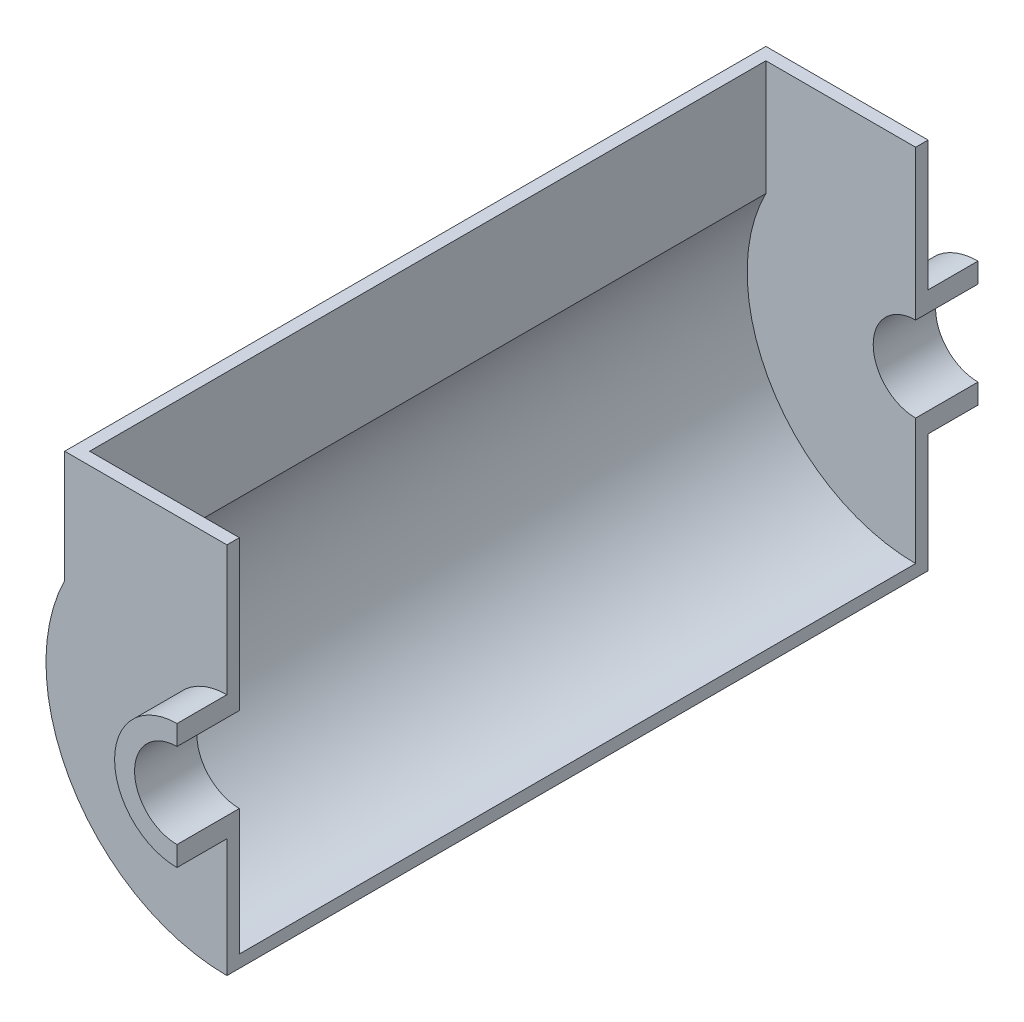
ISO-10303-21;
HEADER;
FILE_DESCRIPTION(('STEP AP214'),'2;1');
FILE_NAME('part.step','',(''),(''),'','','');
FILE_SCHEMA(('AUTOMOTIVE_DESIGN { 1 0 10303 214 1 1 1 1 }'));
ENDSEC;
DATA;
#1=APPLICATION_CONTEXT('core data for automotive mechanical design processes');
#2=APPLICATION_PROTOCOL_DEFINITION('international standard','automotive_design',2000,#1);
#3=PRODUCT_CONTEXT('',#1,'mechanical');
#4=PRODUCT('Part','Part','',(#3));
#5=PRODUCT_RELATED_PRODUCT_CATEGORY('part','',(#4));
#6=PRODUCT_DEFINITION_FORMATION('','',#4);
#7=PRODUCT_DEFINITION_CONTEXT('part definition',#1,'design');
#8=PRODUCT_DEFINITION('design','',#6,#7);
#9=PRODUCT_DEFINITION_SHAPE('','',#8);
#10=(LENGTH_UNIT() NAMED_UNIT(*) SI_UNIT(.MILLI.,.METRE.));
#11=(NAMED_UNIT(*) PLANE_ANGLE_UNIT() SI_UNIT($,.RADIAN.));
#12=(NAMED_UNIT(*) SI_UNIT($,.STERADIAN.) SOLID_ANGLE_UNIT());
#13=UNCERTAINTY_MEASURE_WITH_UNIT(LENGTH_MEASURE(1.E-05),#10,'distance_accuracy_value','');
#14=(GEOMETRIC_REPRESENTATION_CONTEXT(3) GLOBAL_UNCERTAINTY_ASSIGNED_CONTEXT((#13)) GLOBAL_UNIT_ASSIGNED_CONTEXT((#10,
#11,#12)) REPRESENTATION_CONTEXT('',''));
#15=CARTESIAN_POINT('',(0.,0.,0.));
#16=DIRECTION('',(0.,0.,1.));
#17=DIRECTION('',(1.,0.,0.));
#18=AXIS2_PLACEMENT_3D('',#15,#16,#17);
#19=CARTESIAN_POINT('',(0.,0.,-5.));
#20=DIRECTION('',(0.,0.,1.));
#21=DIRECTION('',(1.,0.,0.));
#22=AXIS2_PLACEMENT_3D('',#19,#20,#21);
#23=PLANE('',#22);
#24=CARTESIAN_POINT('',(0.,0.,-5.));
#25=DIRECTION('',(0.,0.,1.));
#26=DIRECTION('',(-1.,0.,0.));
#27=AXIS2_PLACEMENT_3D('',#24,#25,#26);
#28=CIRCLE('',#27,67.5);
#29=CARTESIAN_POINT('',(-60.,30.9232921921324,-5.));
#30=VERTEX_POINT('',#29);
#31=CARTESIAN_POINT('',(0.,-67.5,-5.));
#32=VERTEX_POINT('',#31);
#33=EDGE_CURVE('E209',#30,#32,#28,.T.);
#34=ORIENTED_EDGE('',*,*,#33,.F.);
#35=DIRECTION('',(0.,-1.,0.));
#36=VECTOR('',#35,1.);
#37=CARTESIAN_POINT('',(-60.,77.,-5.));
#38=LINE('',#37,#36);
#39=CARTESIAN_POINT('',(-60.,77.,-5.));
#40=VERTEX_POINT('',#39);
#41=EDGE_CURVE('E57',#40,#30,#38,.T.);
#42=ORIENTED_EDGE('',*,*,#41,.F.);
#43=DIRECTION('',(-1.,0.,0.));
#44=VECTOR('',#43,1.);
#45=CARTESIAN_POINT('',(0.,77.,-5.));
#46=LINE('',#45,#44);
#47=CARTESIAN_POINT('',(0.,77.,-5.));
#48=VERTEX_POINT('',#47);
#49=EDGE_CURVE('E232',#48,#40,#46,.T.);
#50=ORIENTED_EDGE('',*,*,#49,.F.);
#51=DIRECTION('',(0.,1.,0.));
#52=VECTOR('',#51,1.);
#53=CARTESIAN_POINT('',(0.,25.,-5.));
#54=LINE('',#53,#52);
#55=CARTESIAN_POINT('',(0.,17.,-5.));
#56=VERTEX_POINT('',#55);
#57=EDGE_CURVE('E290',#56,#48,#54,.T.);
#58=ORIENTED_EDGE('',*,*,#57,.F.);
#59=CARTESIAN_POINT('',(0.,0.,-5.));
#60=DIRECTION('',(0.,0.,-1.));
#61=DIRECTION('',(1.,0.,0.));
#62=AXIS2_PLACEMENT_3D('',#59,#60,#61);
#63=CIRCLE('',#62,17.);
#64=CARTESIAN_POINT('',(0.,-17.,-5.));
#65=VERTEX_POINT('',#64);
#66=EDGE_CURVE('E286',#65,#56,#63,.T.);
#67=ORIENTED_EDGE('',*,*,#66,.F.);
#68=DIRECTION('',(0.,1.,0.));
#69=VECTOR('',#68,1.);
#70=CARTESIAN_POINT('',(0.,-17.,-5.));
#71=LINE('',#70,#69);
#72=EDGE_CURVE('E63',#32,#65,#71,.T.);
#73=ORIENTED_EDGE('',*,*,#72,.F.);
#74=EDGE_LOOP('',(#34,#42,#50,#58,#67,#73));
#75=FACE_BOUND('',#74,.T.);
#76=ADVANCED_FACE('F39',(#75),#23,.F.);
#77=CARTESIAN_POINT('',(0.,0.,-5.));
#78=DIRECTION('',(0.,0.,1.));
#79=DIRECTION('',(1.,0.,0.));
#80=AXIS2_PLACEMENT_3D('',#77,#78,#79);
#81=CYLINDRICAL_SURFACE('',#80,17.);
#82=DIRECTION('',(0.,0.,1.));
#83=VECTOR('',#82,1.);
#84=CARTESIAN_POINT('',(0.,17.,-5.));
#85=LINE('',#84,#83);
#86=CARTESIAN_POINT('',(0.,17.,20.));
#87=VERTEX_POINT('',#86);
#88=EDGE_CURVE('E43',#56,#87,#85,.T.);
#89=ORIENTED_EDGE('',*,*,#88,.T.);
#90=CARTESIAN_POINT('',(0.,0.,20.));
#91=DIRECTION('',(0.,0.,-1.));
#92=DIRECTION('',(1.,0.,0.));
#93=AXIS2_PLACEMENT_3D('',#90,#91,#92);
#94=CIRCLE('',#93,17.);
#95=CARTESIAN_POINT('',(0.,-17.,20.));
#96=VERTEX_POINT('',#95);
#97=EDGE_CURVE('E262',#96,#87,#94,.T.);
#98=ORIENTED_EDGE('',*,*,#97,.F.);
#99=DIRECTION('',(0.,0.,1.));
#100=VECTOR('',#99,1.);
#101=CARTESIAN_POINT('',(0.,-17.,-5.));
#102=LINE('',#101,#100);
#103=EDGE_CURVE('E11',#65,#96,#102,.T.);
#104=ORIENTED_EDGE('',*,*,#103,.F.);
#105=ORIENTED_EDGE('',*,*,#66,.T.);
#106=EDGE_LOOP('',(#89,#98,#104,#105));
#107=FACE_BOUND('',#106,.T.);
#108=ADVANCED_FACE('F41',(#107),#81,.F.);
#109=CARTESIAN_POINT('',(0.,-17.,-5.));
#110=DIRECTION('',(1.,0.,0.));
#111=DIRECTION('',(0.,0.,-1.));
#112=AXIS2_PLACEMENT_3D('',#109,#110,#111);
#113=PLANE('',#112);
#114=ORIENTED_EDGE('',*,*,#103,.T.);
#115=DIRECTION('',(0.,1.,0.));
#116=VECTOR('',#115,1.);
#117=CARTESIAN_POINT('',(0.,-17.,20.));
#118=LINE('',#117,#116);
#119=CARTESIAN_POINT('',(0.,-25.,20.));
#120=VERTEX_POINT('',#119);
#121=EDGE_CURVE('E282',#120,#96,#118,.T.);
#122=ORIENTED_EDGE('',*,*,#121,.F.);
#123=DIRECTION('',(0.,0.,1.));
#124=VECTOR('',#123,1.);
#125=CARTESIAN_POINT('',(0.,-25.,-5.));
#126=LINE('',#125,#124);
#127=CARTESIAN_POINT('',(0.,-25.,0.));
#128=VERTEX_POINT('',#127);
#129=EDGE_CURVE('E49',#128,#120,#126,.T.);
#130=ORIENTED_EDGE('',*,*,#129,.F.);
#131=DIRECTION('',(0.,1.,0.));
#132=VECTOR('',#131,1.);
#133=CARTESIAN_POINT('',(0.,-25.,0.));
#134=LINE('',#133,#132);
#135=CARTESIAN_POINT('',(0.,-72.5,0.));
#136=VERTEX_POINT('',#135);
#137=EDGE_CURVE('E236',#136,#128,#134,.T.);
#138=ORIENTED_EDGE('',*,*,#137,.F.);
#139=DIRECTION('',(0.,0.,1.));
#140=VECTOR('',#139,1.);
#141=CARTESIAN_POINT('',(0.,-72.5,-5.));
#142=LINE('',#141,#140);
#143=CARTESIAN_POINT('',(0.,-72.5,-281.));
#144=VERTEX_POINT('',#143);
#145=EDGE_CURVE('E259',#144,#136,#142,.T.);
#146=ORIENTED_EDGE('',*,*,#145,.F.);
#147=DIRECTION('',(0.,1.,0.));
#148=VECTOR('',#147,1.);
#149=CARTESIAN_POINT('',(0.,-25.,-281.));
#150=LINE('',#149,#148);
#151=CARTESIAN_POINT('',(0.,-25.,-281.));
#152=VERTEX_POINT('',#151);
#153=EDGE_CURVE('E168',#144,#152,#150,.T.);
#154=ORIENTED_EDGE('',*,*,#153,.T.);
#155=DIRECTION('',(0.,0.,-1.));
#156=VECTOR('',#155,1.);
#157=CARTESIAN_POINT('',(0.,-25.,-276.));
#158=LINE('',#157,#156);
#159=CARTESIAN_POINT('',(0.,-25.,-301.));
#160=VERTEX_POINT('',#159);
#161=EDGE_CURVE('E199',#152,#160,#158,.T.);
#162=ORIENTED_EDGE('',*,*,#161,.T.);
#163=DIRECTION('',(0.,1.,0.));
#164=VECTOR('',#163,1.);
#165=CARTESIAN_POINT('',(0.,-17.,-301.));
#166=LINE('',#165,#164);
#167=CARTESIAN_POINT('',(0.,-17.,-301.));
#168=VERTEX_POINT('',#167);
#169=EDGE_CURVE('E191',#160,#168,#166,.T.);
#170=ORIENTED_EDGE('',*,*,#169,.T.);
#171=DIRECTION('',(0.,0.,-1.));
#172=VECTOR('',#171,1.);
#173=CARTESIAN_POINT('',(0.,-17.,-276.));
#174=LINE('',#173,#172);
#175=CARTESIAN_POINT('',(0.,-17.,-276.));
#176=VERTEX_POINT('',#175);
#177=EDGE_CURVE('E195',#176,#168,#174,.T.);
#178=ORIENTED_EDGE('',*,*,#177,.F.);
#179=DIRECTION('',(0.,1.,0.));
#180=VECTOR('',#179,1.);
#181=CARTESIAN_POINT('',(0.,-17.,-276.));
#182=LINE('',#181,#180);
#183=CARTESIAN_POINT('',(0.,-67.5,-276.));
#184=VERTEX_POINT('',#183);
#185=EDGE_CURVE('E185',#184,#176,#182,.T.);
#186=ORIENTED_EDGE('',*,*,#185,.F.);
#187=DIRECTION('',(0.,0.,1.));
#188=VECTOR('',#187,1.);
#189=CARTESIAN_POINT('',(0.,-67.5,-442.152038807834));
#190=LINE('',#189,#188);
#191=EDGE_CURVE('E213',#184,#32,#190,.T.);
#192=ORIENTED_EDGE('',*,*,#191,.T.);
#193=ORIENTED_EDGE('',*,*,#72,.T.);
#194=EDGE_LOOP('',(#114,#122,#130,#138,#146,#154,#162,#170,#178,#186,#192,#193));
#195=FACE_BOUND('',#194,.T.);
#196=ADVANCED_FACE('F313',(#195),#113,.T.);
#197=CARTESIAN_POINT('',(0.,0.,-5.));
#198=DIRECTION('',(0.,0.,1.));
#199=DIRECTION('',(1.,0.,0.));
#200=AXIS2_PLACEMENT_3D('',#197,#198,#199);
#201=CYLINDRICAL_SURFACE('',#200,25.);
#202=CARTESIAN_POINT('',(0.,0.,0.));
#203=DIRECTION('',(0.,0.,-1.));
#204=DIRECTION('',(1.,0.,0.));
#205=AXIS2_PLACEMENT_3D('',#202,#203,#204);
#206=CIRCLE('',#205,25.);
#207=CARTESIAN_POINT('',(0.,25.,0.));
#208=VERTEX_POINT('',#207);
#209=EDGE_CURVE('E221',#128,#208,#206,.T.);
#210=ORIENTED_EDGE('',*,*,#209,.F.);
#211=ORIENTED_EDGE('',*,*,#129,.T.);
#212=CARTESIAN_POINT('',(0.,0.,20.));
#213=DIRECTION('',(0.,0.,1.));
#214=DIRECTION('',(1.,0.,0.));
#215=AXIS2_PLACEMENT_3D('',#212,#213,#214);
#216=CIRCLE('',#215,25.);
#217=CARTESIAN_POINT('',(0.,25.,20.));
#218=VERTEX_POINT('',#217);
#219=EDGE_CURVE('E278',#218,#120,#216,.T.);
#220=ORIENTED_EDGE('',*,*,#219,.F.);
#221=DIRECTION('',(0.,0.,1.));
#222=VECTOR('',#221,1.);
#223=CARTESIAN_POINT('',(0.,25.,-5.));
#224=LINE('',#223,#222);
#225=EDGE_CURVE('E296',#208,#218,#224,.T.);
#226=ORIENTED_EDGE('',*,*,#225,.F.);
#227=EDGE_LOOP('',(#210,#211,#220,#226));
#228=FACE_BOUND('',#227,.T.);
#229=ADVANCED_FACE('F320',(#228),#201,.T.);
#230=CARTESIAN_POINT('',(0.,25.,-5.));
#231=DIRECTION('',(1.,0.,0.));
#232=DIRECTION('',(0.,0.,-1.));
#233=AXIS2_PLACEMENT_3D('',#230,#231,#232);
#234=PLANE('',#233);
#235=ORIENTED_EDGE('',*,*,#57,.T.);
#236=DIRECTION('',(0.,0.,1.));
#237=VECTOR('',#236,1.);
#238=CARTESIAN_POINT('',(0.,77.,-5.));
#239=LINE('',#238,#237);
#240=CARTESIAN_POINT('',(0.,77.,0.));
#241=VERTEX_POINT('',#240);
#242=EDGE_CURVE('E235',#48,#241,#239,.T.);
#243=ORIENTED_EDGE('',*,*,#242,.T.);
#244=DIRECTION('',(0.,1.,0.));
#245=VECTOR('',#244,1.);
#246=CARTESIAN_POINT('',(0.,25.,0.));
#247=LINE('',#246,#245);
#248=EDGE_CURVE('E240',#208,#241,#247,.T.);
#249=ORIENTED_EDGE('',*,*,#248,.F.);
#250=ORIENTED_EDGE('',*,*,#225,.T.);
#251=DIRECTION('',(0.,1.,0.));
#252=VECTOR('',#251,1.);
#253=CARTESIAN_POINT('',(0.,25.,20.));
#254=LINE('',#253,#252);
#255=EDGE_CURVE('E274',#87,#218,#254,.T.);
#256=ORIENTED_EDGE('',*,*,#255,.F.);
#257=ORIENTED_EDGE('',*,*,#88,.F.);
#258=EDGE_LOOP('',(#235,#243,#249,#250,#256,#257));
#259=FACE_BOUND('',#258,.T.);
#260=ADVANCED_FACE('F306',(#259),#234,.T.);
#261=CARTESIAN_POINT('',(0.,0.,20.));
#262=DIRECTION('',(0.,0.,1.));
#263=DIRECTION('',(1.,0.,0.));
#264=AXIS2_PLACEMENT_3D('',#261,#262,#263);
#265=PLANE('',#264);
#266=ORIENTED_EDGE('',*,*,#97,.T.);
#267=ORIENTED_EDGE('',*,*,#255,.T.);
#268=ORIENTED_EDGE('',*,*,#219,.T.);
#269=ORIENTED_EDGE('',*,*,#121,.T.);
#270=EDGE_LOOP('',(#266,#267,#268,#269));
#271=FACE_BOUND('',#270,.T.);
#272=ADVANCED_FACE('F309',(#271),#265,.T.);
#273=CARTESIAN_POINT('',(0.,0.,-5.));
#274=DIRECTION('',(0.,0.,1.));
#275=DIRECTION('',(1.,0.,0.));
#276=AXIS2_PLACEMENT_3D('',#273,#274,#275);
#277=CYLINDRICAL_SURFACE('',#276,72.5);
#278=CARTESIAN_POINT('',(0.,0.,0.));
#279=DIRECTION('',(0.,0.,1.));
#280=DIRECTION('',(1.,0.,0.));
#281=AXIS2_PLACEMENT_3D('',#278,#279,#280);
#282=CIRCLE('',#281,72.5);
#283=CARTESIAN_POINT('',(-65.,32.1130814466628,0.));
#284=VERTEX_POINT('',#283);
#285=EDGE_CURVE('E252',#284,#136,#282,.T.);
#286=ORIENTED_EDGE('',*,*,#285,.F.);
#287=DIRECTION('',(0.,0.,1.));
#288=VECTOR('',#287,1.);
#289=CARTESIAN_POINT('',(-65.,32.1130814466628,-5.));
#290=LINE('',#289,#288);
#291=CARTESIAN_POINT('',(-65.,32.1130814466628,-281.));
#292=VERTEX_POINT('',#291);
#293=EDGE_CURVE('E263',#292,#284,#290,.T.);
#294=ORIENTED_EDGE('',*,*,#293,.F.);
#295=CARTESIAN_POINT('',(0.,0.,-281.));
#296=DIRECTION('',(0.,0.,1.));
#297=DIRECTION('',(1.,0.,0.));
#298=AXIS2_PLACEMENT_3D('',#295,#296,#297);
#299=CIRCLE('',#298,72.5);
#300=EDGE_CURVE('E390',#292,#144,#299,.T.);
#301=ORIENTED_EDGE('',*,*,#300,.T.);
#302=ORIENTED_EDGE('',*,*,#145,.T.);
#303=EDGE_LOOP('',(#286,#294,#301,#302));
#304=FACE_BOUND('',#303,.T.);
#305=ADVANCED_FACE('F336',(#304),#277,.T.);
#306=CARTESIAN_POINT('',(-65.,77.,-5.));
#307=DIRECTION('',(-1.,0.,0.));
#308=DIRECTION('',(0.,-1.,0.));
#309=AXIS2_PLACEMENT_3D('',#306,#307,#308);
#310=PLANE('',#309);
#311=DIRECTION('',(0.,-1.,0.));
#312=VECTOR('',#311,1.);
#313=CARTESIAN_POINT('',(-65.,77.,0.));
#314=LINE('',#313,#312);
#315=CARTESIAN_POINT('',(-65.,77.,0.));
#316=VERTEX_POINT('',#315);
#317=EDGE_CURVE('E248',#316,#284,#314,.T.);
#318=ORIENTED_EDGE('',*,*,#317,.F.);
#319=DIRECTION('',(0.,0.,1.));
#320=VECTOR('',#319,1.);
#321=CARTESIAN_POINT('',(-65.,77.,-5.));
#322=LINE('',#321,#320);
#323=CARTESIAN_POINT('',(-65.,77.,-281.));
#324=VERTEX_POINT('',#323);
#325=EDGE_CURVE('E266',#324,#316,#322,.T.);
#326=ORIENTED_EDGE('',*,*,#325,.F.);
#327=DIRECTION('',(0.,-1.,0.));
#328=VECTOR('',#327,1.);
#329=CARTESIAN_POINT('',(-65.,77.,-281.));
#330=LINE('',#329,#328);
#331=EDGE_CURVE('E393',#324,#292,#330,.T.);
#332=ORIENTED_EDGE('',*,*,#331,.T.);
#333=ORIENTED_EDGE('',*,*,#293,.T.);
#334=EDGE_LOOP('',(#318,#326,#332,#333));
#335=FACE_BOUND('',#334,.T.);
#336=ADVANCED_FACE('F339',(#335),#310,.T.);
#337=CARTESIAN_POINT('',(0.,77.,-5.));
#338=DIRECTION('',(0.,1.,0.));
#339=DIRECTION('',(0.,0.,1.));
#340=AXIS2_PLACEMENT_3D('',#337,#338,#339);
#341=PLANE('',#340);
#342=DIRECTION('',(-1.,0.,0.));
#343=VECTOR('',#342,1.);
#344=CARTESIAN_POINT('',(0.,77.,0.));
#345=LINE('',#344,#343);
#346=EDGE_CURVE('E244',#241,#316,#345,.T.);
#347=ORIENTED_EDGE('',*,*,#346,.F.);
#348=ORIENTED_EDGE('',*,*,#242,.F.);
#349=ORIENTED_EDGE('',*,*,#49,.T.);
#350=DIRECTION('',(0.,0.,1.));
#351=VECTOR('',#350,1.);
#352=CARTESIAN_POINT('',(-60.,77.,-442.152038807834));
#353=LINE('',#352,#351);
#354=CARTESIAN_POINT('',(-60.,77.,-276.));
#355=VERTEX_POINT('',#354);
#356=EDGE_CURVE('E163',#355,#40,#353,.T.);
#357=ORIENTED_EDGE('',*,*,#356,.F.);
#358=DIRECTION('',(-1.,0.,0.));
#359=VECTOR('',#358,1.);
#360=CARTESIAN_POINT('',(0.,77.,-276.));
#361=LINE('',#360,#359);
#362=CARTESIAN_POINT('',(0.,77.,-276.));
#363=VERTEX_POINT('',#362);
#364=EDGE_CURVE('E155',#363,#355,#361,.T.);
#365=ORIENTED_EDGE('',*,*,#364,.F.);
#366=DIRECTION('',(0.,0.,-1.));
#367=VECTOR('',#366,1.);
#368=CARTESIAN_POINT('',(0.,77.,-276.));
#369=LINE('',#368,#367);
#370=CARTESIAN_POINT('',(0.,77.,-281.));
#371=VERTEX_POINT('',#370);
#372=EDGE_CURVE('E160',#363,#371,#369,.T.);
#373=ORIENTED_EDGE('',*,*,#372,.T.);
#374=DIRECTION('',(-1.,0.,0.));
#375=VECTOR('',#374,1.);
#376=CARTESIAN_POINT('',(0.,77.,-281.));
#377=LINE('',#376,#375);
#378=EDGE_CURVE('E412',#371,#324,#377,.T.);
#379=ORIENTED_EDGE('',*,*,#378,.T.);
#380=ORIENTED_EDGE('',*,*,#325,.T.);
#381=EDGE_LOOP('',(#347,#348,#349,#357,#365,#373,#379,#380));
#382=FACE_BOUND('',#381,.T.);
#383=ADVANCED_FACE('F158',(#382),#341,.T.);
#384=CARTESIAN_POINT('',(0.,0.,0.));
#385=DIRECTION('',(0.,0.,1.));
#386=DIRECTION('',(1.,0.,0.));
#387=AXIS2_PLACEMENT_3D('',#384,#385,#386);
#388=PLANE('',#387);
#389=ORIENTED_EDGE('',*,*,#209,.T.);
#390=ORIENTED_EDGE('',*,*,#248,.T.);
#391=ORIENTED_EDGE('',*,*,#346,.T.);
#392=ORIENTED_EDGE('',*,*,#317,.T.);
#393=ORIENTED_EDGE('',*,*,#285,.T.);
#394=ORIENTED_EDGE('',*,*,#137,.T.);
#395=EDGE_LOOP('',(#389,#390,#391,#392,#393,#394));
#396=FACE_BOUND('',#395,.T.);
#397=ADVANCED_FACE('F318',(#396),#388,.T.);
#398=CARTESIAN_POINT('',(-60.,77.,-442.152038807834));
#399=DIRECTION('',(-1.,0.,0.));
#400=DIRECTION('',(0.,0.,1.));
#401=AXIS2_PLACEMENT_3D('',#398,#399,#400);
#402=PLANE('',#401);
#403=DIRECTION('',(0.,-1.,0.));
#404=VECTOR('',#403,1.);
#405=CARTESIAN_POINT('',(-60.,77.,-276.));
#406=LINE('',#405,#404);
#407=CARTESIAN_POINT('',(-60.,30.9232921921324,-276.));
#408=VERTEX_POINT('',#407);
#409=EDGE_CURVE('E222',#355,#408,#406,.T.);
#410=ORIENTED_EDGE('',*,*,#409,.F.);
#411=ORIENTED_EDGE('',*,*,#356,.T.);
#412=ORIENTED_EDGE('',*,*,#41,.T.);
#413=DIRECTION('',(0.,0.,1.));
#414=VECTOR('',#413,1.);
#415=CARTESIAN_POINT('',(-60.,30.9232921921324,-442.152038807834));
#416=LINE('',#415,#414);
#417=EDGE_CURVE('E214',#408,#30,#416,.T.);
#418=ORIENTED_EDGE('',*,*,#417,.F.);
#419=EDGE_LOOP('',(#410,#411,#412,#418));
#420=FACE_BOUND('',#419,.T.);
#421=ADVANCED_FACE('F348',(#420),#402,.F.);
#422=CARTESIAN_POINT('',(0.,0.,-442.152038807834));
#423=DIRECTION('',(0.,0.,1.));
#424=DIRECTION('',(1.,0.,0.));
#425=AXIS2_PLACEMENT_3D('',#422,#423,#424);
#426=CYLINDRICAL_SURFACE('',#425,67.5);
#427=CARTESIAN_POINT('',(0.,0.,-276.));
#428=DIRECTION('',(0.,0.,-1.));
#429=DIRECTION('',(-1.,0.,0.));
#430=AXIS2_PLACEMENT_3D('',#427,#428,#429);
#431=CIRCLE('',#430,67.5);
#432=EDGE_CURVE('E217',#408,#184,#431,.F.);
#433=ORIENTED_EDGE('',*,*,#432,.F.);
#434=ORIENTED_EDGE('',*,*,#417,.T.);
#435=ORIENTED_EDGE('',*,*,#33,.T.);
#436=ORIENTED_EDGE('',*,*,#191,.F.);
#437=EDGE_LOOP('',(#433,#434,#435,#436));
#438=FACE_BOUND('',#437,.T.);
#439=ADVANCED_FACE('F351',(#438),#426,.F.);
#440=CARTESIAN_POINT('',(0.,0.,-276.));
#441=DIRECTION('',(0.,0.,-1.));
#442=DIRECTION('',(1.,0.,0.));
#443=AXIS2_PLACEMENT_3D('',#440,#441,#442);
#444=PLANE('',#443);
#445=ORIENTED_EDGE('',*,*,#364,.T.);
#446=ORIENTED_EDGE('',*,*,#409,.T.);
#447=ORIENTED_EDGE('',*,*,#432,.T.);
#448=ORIENTED_EDGE('',*,*,#185,.T.);
#449=CARTESIAN_POINT('',(0.,0.,-276.));
#450=DIRECTION('',(0.,0.,-1.));
#451=DIRECTION('',(1.,0.,0.));
#452=AXIS2_PLACEMENT_3D('',#449,#450,#451);
#453=CIRCLE('',#452,17.);
#454=CARTESIAN_POINT('',(0.,17.,-276.));
#455=VERTEX_POINT('',#454);
#456=EDGE_CURVE('E182',#176,#455,#453,.T.);
#457=ORIENTED_EDGE('',*,*,#456,.T.);
#458=DIRECTION('',(0.,1.,0.));
#459=VECTOR('',#458,1.);
#460=CARTESIAN_POINT('',(0.,25.,-276.));
#461=LINE('',#460,#459);
#462=EDGE_CURVE('E173',#455,#363,#461,.T.);
#463=ORIENTED_EDGE('',*,*,#462,.T.);
#464=EDGE_LOOP('',(#445,#446,#447,#448,#457,#463));
#465=FACE_BOUND('',#464,.T.);
#466=ADVANCED_FACE('F180',(#465),#444,.F.);
#467=CARTESIAN_POINT('',(0.,0.,-276.));
#468=DIRECTION('',(0.,0.,-1.));
#469=DIRECTION('',(1.,0.,0.));
#470=AXIS2_PLACEMENT_3D('',#467,#468,#469);
#471=CYLINDRICAL_SURFACE('',#470,17.);
#472=DIRECTION('',(0.,0.,-1.));
#473=VECTOR('',#472,1.);
#474=CARTESIAN_POINT('',(0.,17.,-276.));
#475=LINE('',#474,#473);
#476=CARTESIAN_POINT('',(0.,17.,-301.));
#477=VERTEX_POINT('',#476);
#478=EDGE_CURVE('E189',#455,#477,#475,.T.);
#479=ORIENTED_EDGE('',*,*,#478,.F.);
#480=ORIENTED_EDGE('',*,*,#456,.F.);
#481=ORIENTED_EDGE('',*,*,#177,.T.);
#482=CARTESIAN_POINT('',(0.,0.,-301.));
#483=DIRECTION('',(0.,0.,-1.));
#484=DIRECTION('',(1.,0.,0.));
#485=AXIS2_PLACEMENT_3D('',#482,#483,#484);
#486=CIRCLE('',#485,17.);
#487=EDGE_CURVE('E178',#168,#477,#486,.T.);
#488=ORIENTED_EDGE('',*,*,#487,.T.);
#489=EDGE_LOOP('',(#479,#480,#481,#488));
#490=FACE_BOUND('',#489,.T.);
#491=ADVANCED_FACE('F356',(#490),#471,.F.);
#492=CARTESIAN_POINT('',(0.,0.,-276.));
#493=DIRECTION('',(0.,0.,-1.));
#494=DIRECTION('',(1.,0.,0.));
#495=AXIS2_PLACEMENT_3D('',#492,#493,#494);
#496=CYLINDRICAL_SURFACE('',#495,25.);
#497=CARTESIAN_POINT('',(0.,0.,-281.));
#498=DIRECTION('',(0.,0.,-1.));
#499=DIRECTION('',(1.,0.,0.));
#500=AXIS2_PLACEMENT_3D('',#497,#498,#499);
#501=CIRCLE('',#500,25.);
#502=CARTESIAN_POINT('',(0.,25.,-281.));
#503=VERTEX_POINT('',#502);
#504=EDGE_CURVE('E379',#152,#503,#501,.T.);
#505=ORIENTED_EDGE('',*,*,#504,.T.);
#506=DIRECTION('',(0.,0.,-1.));
#507=VECTOR('',#506,1.);
#508=CARTESIAN_POINT('',(0.,25.,-276.));
#509=LINE('',#508,#507);
#510=CARTESIAN_POINT('',(0.,25.,-301.));
#511=VERTEX_POINT('',#510);
#512=EDGE_CURVE('E203',#503,#511,#509,.T.);
#513=ORIENTED_EDGE('',*,*,#512,.T.);
#514=CARTESIAN_POINT('',(0.,0.,-301.));
#515=DIRECTION('',(0.,0.,1.));
#516=DIRECTION('',(1.,0.,0.));
#517=AXIS2_PLACEMENT_3D('',#514,#515,#516);
#518=CIRCLE('',#517,25.);
#519=EDGE_CURVE('E386',#511,#160,#518,.T.);
#520=ORIENTED_EDGE('',*,*,#519,.T.);
#521=ORIENTED_EDGE('',*,*,#161,.F.);
#522=EDGE_LOOP('',(#505,#513,#520,#521));
#523=FACE_BOUND('',#522,.T.);
#524=ADVANCED_FACE('F359',(#523),#496,.T.);
#525=CARTESIAN_POINT('',(0.,25.,-276.));
#526=DIRECTION('',(1.,0.,0.));
#527=DIRECTION('',(0.,0.,1.));
#528=AXIS2_PLACEMENT_3D('',#525,#526,#527);
#529=PLANE('',#528);
#530=ORIENTED_EDGE('',*,*,#462,.F.);
#531=ORIENTED_EDGE('',*,*,#478,.T.);
#532=DIRECTION('',(0.,1.,0.));
#533=VECTOR('',#532,1.);
#534=CARTESIAN_POINT('',(0.,25.,-301.));
#535=LINE('',#534,#533);
#536=EDGE_CURVE('E400',#477,#511,#535,.T.);
#537=ORIENTED_EDGE('',*,*,#536,.T.);
#538=ORIENTED_EDGE('',*,*,#512,.F.);
#539=DIRECTION('',(0.,1.,0.));
#540=VECTOR('',#539,1.);
#541=CARTESIAN_POINT('',(0.,25.,-281.));
#542=LINE('',#541,#540);
#543=EDGE_CURVE('E176',#503,#371,#542,.T.);
#544=ORIENTED_EDGE('',*,*,#543,.T.);
#545=ORIENTED_EDGE('',*,*,#372,.F.);
#546=EDGE_LOOP('',(#530,#531,#537,#538,#544,#545));
#547=FACE_BOUND('',#546,.T.);
#548=ADVANCED_FACE('F171',(#547),#529,.T.);
#549=CARTESIAN_POINT('',(0.,0.,-301.));
#550=DIRECTION('',(0.,0.,-1.));
#551=DIRECTION('',(1.,0.,0.));
#552=AXIS2_PLACEMENT_3D('',#549,#550,#551);
#553=PLANE('',#552);
#554=ORIENTED_EDGE('',*,*,#487,.F.);
#555=ORIENTED_EDGE('',*,*,#169,.F.);
#556=ORIENTED_EDGE('',*,*,#519,.F.);
#557=ORIENTED_EDGE('',*,*,#536,.F.);
#558=EDGE_LOOP('',(#554,#555,#556,#557));
#559=FACE_BOUND('',#558,.T.);
#560=ADVANCED_FACE('F363',(#559),#553,.T.);
#561=CARTESIAN_POINT('',(0.,0.,-281.));
#562=DIRECTION('',(0.,0.,-1.));
#563=DIRECTION('',(1.,0.,0.));
#564=AXIS2_PLACEMENT_3D('',#561,#562,#563);
#565=PLANE('',#564);
#566=ORIENTED_EDGE('',*,*,#504,.F.);
#567=ORIENTED_EDGE('',*,*,#153,.F.);
#568=ORIENTED_EDGE('',*,*,#300,.F.);
#569=ORIENTED_EDGE('',*,*,#331,.F.);
#570=ORIENTED_EDGE('',*,*,#378,.F.);
#571=ORIENTED_EDGE('',*,*,#543,.F.);
#572=EDGE_LOOP('',(#566,#567,#568,#569,#570,#571));
#573=FACE_BOUND('',#572,.T.);
#574=ADVANCED_FACE('F371',(#573),#565,.T.);
#575=CLOSED_SHELL('',(#76,#108,#196,#229,#260,#272,#305,#336,#383,#397,#421,#439,#466,#491,#524,
#548,#560,#574));
#576=MANIFOLD_SOLID_BREP('B2',#575);
#577=ADVANCED_BREP_SHAPE_REPRESENTATION('',(#18,#576),#14);
#578=SHAPE_DEFINITION_REPRESENTATION(#9,#577);
ENDSEC;
END-ISO-10303-21;
